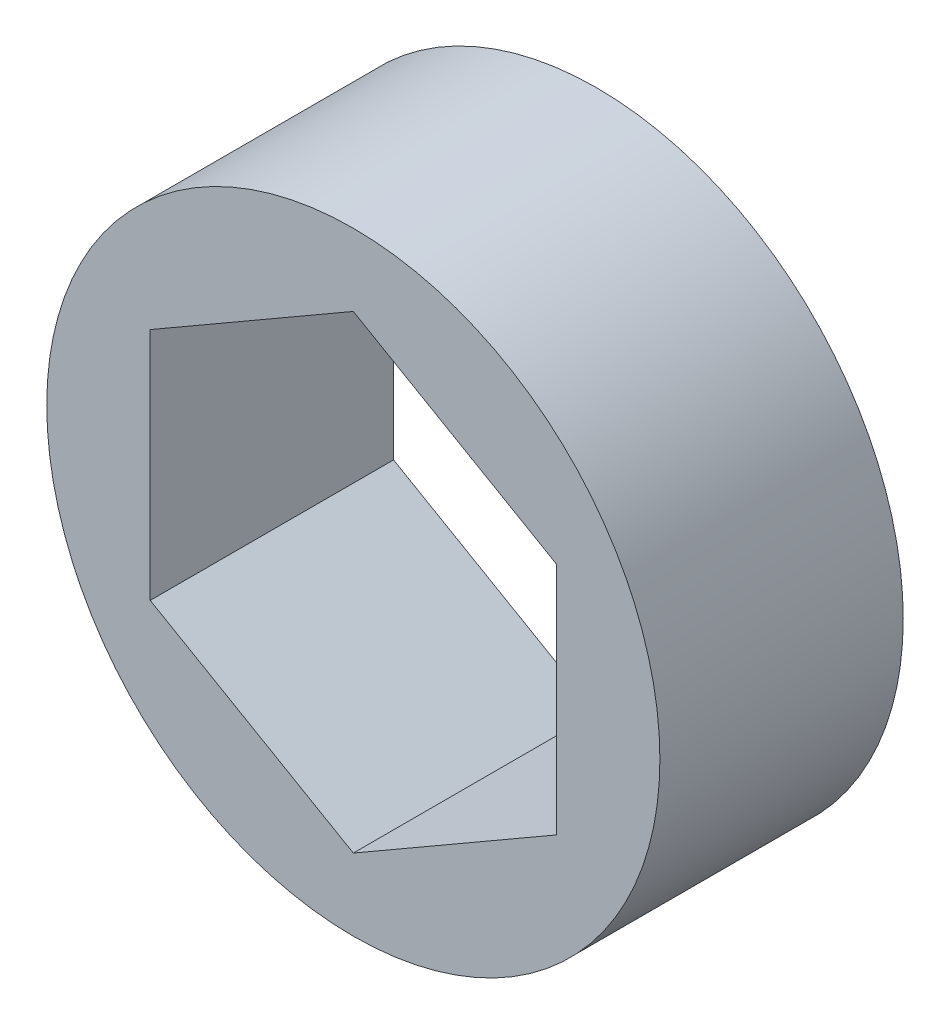
ISO-10303-21;
HEADER;
FILE_DESCRIPTION(('STEP AP214'),'2;1');
FILE_NAME('part.step','',(''),(''),'','','');
FILE_SCHEMA(('AUTOMOTIVE_DESIGN { 1 0 10303 214 1 1 1 1 }'));
ENDSEC;
DATA;
#1=APPLICATION_CONTEXT('core data for automotive mechanical design processes');
#2=APPLICATION_PROTOCOL_DEFINITION('international standard','automotive_design',2000,#1);
#3=PRODUCT_CONTEXT('',#1,'mechanical');
#4=PRODUCT('Part','Part','',(#3));
#5=PRODUCT_RELATED_PRODUCT_CATEGORY('part','',(#4));
#6=PRODUCT_DEFINITION_FORMATION('','',#4);
#7=PRODUCT_DEFINITION_CONTEXT('part definition',#1,'design');
#8=PRODUCT_DEFINITION('design','',#6,#7);
#9=PRODUCT_DEFINITION_SHAPE('','',#8);
#10=(LENGTH_UNIT() NAMED_UNIT(*) SI_UNIT(.MILLI.,.METRE.));
#11=(NAMED_UNIT(*) PLANE_ANGLE_UNIT() SI_UNIT($,.RADIAN.));
#12=(NAMED_UNIT(*) SI_UNIT($,.STERADIAN.) SOLID_ANGLE_UNIT());
#13=UNCERTAINTY_MEASURE_WITH_UNIT(LENGTH_MEASURE(1.E-05),#10,'distance_accuracy_value','');
#14=(GEOMETRIC_REPRESENTATION_CONTEXT(3) GLOBAL_UNCERTAINTY_ASSIGNED_CONTEXT((#13)) GLOBAL_UNIT_ASSIGNED_CONTEXT((#10,
#11,#12)) REPRESENTATION_CONTEXT('',''));
#15=CARTESIAN_POINT('',(0.,0.,0.));
#16=DIRECTION('',(0.,0.,1.));
#17=DIRECTION('',(1.,0.,0.));
#18=AXIS2_PLACEMENT_3D('',#15,#16,#17);
#19=CARTESIAN_POINT('',(0.,0.,8.0645));
#20=DIRECTION('',(0.,0.,1.));
#21=DIRECTION('',(1.,0.,0.));
#22=AXIS2_PLACEMENT_3D('',#19,#20,#21);
#23=PLANE('',#22);
#24=CARTESIAN_POINT('',(0.,0.,8.0645));
#25=DIRECTION('',(0.,0.,1.));
#26=DIRECTION('',(1.,0.,0.));
#27=AXIS2_PLACEMENT_3D('',#24,#25,#26);
#28=CIRCLE('',#27,10.16);
#29=CARTESIAN_POINT('',(10.16,0.,8.0645));
#30=VERTEX_POINT('',#29);
#31=EDGE_CURVE('E11',#30,#30,#28,.T.);
#32=ORIENTED_EDGE('',*,*,#31,.T.);
#33=EDGE_LOOP('',(#32));
#34=FACE_BOUND('',#33,.T.);
#35=DIRECTION('',(-0.866025403784439,0.5,0.));
#36=VECTOR('',#35,1.);
#37=CARTESIAN_POINT('',(6.731,3.88614466191537,8.0645));
#38=LINE('',#37,#36);
#39=CARTESIAN_POINT('',(6.731,3.88614466191537,8.0645));
#40=VERTEX_POINT('',#39);
#41=CARTESIAN_POINT('',(0.,7.77228932383074,8.0645));
#42=VERTEX_POINT('',#41);
#43=EDGE_CURVE('E98',#40,#42,#38,.T.);
#44=ORIENTED_EDGE('',*,*,#43,.F.);
#45=DIRECTION('',(0.,1.,0.));
#46=VECTOR('',#45,1.);
#47=CARTESIAN_POINT('',(6.731,-3.88614466191537,8.0645));
#48=LINE('',#47,#46);
#49=CARTESIAN_POINT('',(6.731,-3.88614466191537,8.0645));
#50=VERTEX_POINT('',#49);
#51=EDGE_CURVE('E90',#50,#40,#48,.T.);
#52=ORIENTED_EDGE('',*,*,#51,.F.);
#53=DIRECTION('',(0.866025403784439,0.5,0.));
#54=VECTOR('',#53,1.);
#55=CARTESIAN_POINT('',(0.,-7.77228932383074,8.0645));
#56=LINE('',#55,#54);
#57=CARTESIAN_POINT('',(0.,-7.77228932383074,8.0645));
#58=VERTEX_POINT('',#57);
#59=EDGE_CURVE('E118',#58,#50,#56,.T.);
#60=ORIENTED_EDGE('',*,*,#59,.F.);
#61=DIRECTION('',(0.866025403784439,-0.5,0.));
#62=VECTOR('',#61,1.);
#63=CARTESIAN_POINT('',(-6.731,-3.88614466191537,8.0645));
#64=LINE('',#63,#62);
#65=CARTESIAN_POINT('',(-6.731,-3.88614466191537,8.0645));
#66=VERTEX_POINT('',#65);
#67=EDGE_CURVE('E116',#66,#58,#64,.T.);
#68=ORIENTED_EDGE('',*,*,#67,.F.);
#69=DIRECTION('',(0.,-1.,0.));
#70=VECTOR('',#69,1.);
#71=CARTESIAN_POINT('',(-6.731,3.88614466191537,8.0645));
#72=LINE('',#71,#70);
#73=CARTESIAN_POINT('',(-6.731,3.88614466191537,8.0645));
#74=VERTEX_POINT('',#73);
#75=EDGE_CURVE('E112',#74,#66,#72,.T.);
#76=ORIENTED_EDGE('',*,*,#75,.F.);
#77=DIRECTION('',(-0.866025403784439,-0.5,0.));
#78=VECTOR('',#77,1.);
#79=CARTESIAN_POINT('',(0.,7.77228932383074,8.0645));
#80=LINE('',#79,#78);
#81=EDGE_CURVE('E110',#42,#74,#80,.T.);
#82=ORIENTED_EDGE('',*,*,#81,.F.);
#83=EDGE_LOOP('',(#44,#52,#60,#68,#76,#82));
#84=FACE_BOUND('',#83,.T.);
#85=ADVANCED_FACE('F37',(#34,#84),#23,.T.);
#86=CARTESIAN_POINT('',(0.,0.,0.));
#87=DIRECTION('',(0.,0.,1.));
#88=DIRECTION('',(1.,0.,0.));
#89=AXIS2_PLACEMENT_3D('',#86,#87,#88);
#90=PLANE('',#89);
#91=CARTESIAN_POINT('',(0.,0.,0.));
#92=DIRECTION('',(0.,0.,1.));
#93=DIRECTION('',(1.,0.,0.));
#94=AXIS2_PLACEMENT_3D('',#91,#92,#93);
#95=CIRCLE('',#94,10.16);
#96=CARTESIAN_POINT('',(10.16,0.,0.));
#97=VERTEX_POINT('',#96);
#98=EDGE_CURVE('E41',#97,#97,#95,.T.);
#99=ORIENTED_EDGE('',*,*,#98,.F.);
#100=EDGE_LOOP('',(#99));
#101=FACE_BOUND('',#100,.T.);
#102=DIRECTION('',(0.,1.,0.));
#103=VECTOR('',#102,1.);
#104=CARTESIAN_POINT('',(6.731,-3.88614466191537,0.));
#105=LINE('',#104,#103);
#106=CARTESIAN_POINT('',(6.731,-3.88614466191537,0.));
#107=VERTEX_POINT('',#106);
#108=CARTESIAN_POINT('',(6.731,3.88614466191537,0.));
#109=VERTEX_POINT('',#108);
#110=EDGE_CURVE('E60',#107,#109,#105,.T.);
#111=ORIENTED_EDGE('',*,*,#110,.T.);
#112=DIRECTION('',(-0.866025403784439,0.5,0.));
#113=VECTOR('',#112,1.);
#114=CARTESIAN_POINT('',(6.731,3.88614466191537,0.));
#115=LINE('',#114,#113);
#116=CARTESIAN_POINT('',(0.,7.77228932383074,0.));
#117=VERTEX_POINT('',#116);
#118=EDGE_CURVE('E105',#109,#117,#115,.T.);
#119=ORIENTED_EDGE('',*,*,#118,.T.);
#120=DIRECTION('',(-0.866025403784439,-0.5,0.));
#121=VECTOR('',#120,1.);
#122=CARTESIAN_POINT('',(0.,7.77228932383074,0.));
#123=LINE('',#122,#121);
#124=CARTESIAN_POINT('',(-6.731,3.88614466191537,0.));
#125=VERTEX_POINT('',#124);
#126=EDGE_CURVE('E122',#117,#125,#123,.T.);
#127=ORIENTED_EDGE('',*,*,#126,.T.);
#128=DIRECTION('',(0.,-1.,0.));
#129=VECTOR('',#128,1.);
#130=CARTESIAN_POINT('',(-6.731,3.88614466191537,0.));
#131=LINE('',#130,#129);
#132=CARTESIAN_POINT('',(-6.731,-3.88614466191537,0.));
#133=VERTEX_POINT('',#132);
#134=EDGE_CURVE('E125',#125,#133,#131,.T.);
#135=ORIENTED_EDGE('',*,*,#134,.T.);
#136=DIRECTION('',(0.866025403784439,-0.5,0.));
#137=VECTOR('',#136,1.);
#138=CARTESIAN_POINT('',(-6.731,-3.88614466191537,0.));
#139=LINE('',#138,#137);
#140=CARTESIAN_POINT('',(0.,-7.77228932383074,0.));
#141=VERTEX_POINT('',#140);
#142=EDGE_CURVE('E128',#133,#141,#139,.T.);
#143=ORIENTED_EDGE('',*,*,#142,.T.);
#144=DIRECTION('',(0.866025403784439,0.5,0.));
#145=VECTOR('',#144,1.);
#146=CARTESIAN_POINT('',(0.,-7.77228932383074,0.));
#147=LINE('',#146,#145);
#148=EDGE_CURVE('E99',#141,#107,#147,.T.);
#149=ORIENTED_EDGE('',*,*,#148,.T.);
#150=EDGE_LOOP('',(#111,#119,#127,#135,#143,#149));
#151=FACE_BOUND('',#150,.T.);
#152=ADVANCED_FACE('F145',(#101,#151),#90,.F.);
#153=CARTESIAN_POINT('',(0.,0.,8.0645));
#154=DIRECTION('',(0.,0.,-1.));
#155=DIRECTION('',(-1.,0.,0.));
#156=AXIS2_PLACEMENT_3D('',#153,#154,#155);
#157=CYLINDRICAL_SURFACE('',#156,10.16);
#158=ORIENTED_EDGE('',*,*,#31,.F.);
#159=EDGE_LOOP('',(#158));
#160=FACE_BOUND('',#159,.T.);
#161=ORIENTED_EDGE('',*,*,#98,.T.);
#162=EDGE_LOOP('',(#161));
#163=FACE_BOUND('',#162,.T.);
#164=ADVANCED_FACE('F39',(#160,#163),#157,.T.);
#165=CARTESIAN_POINT('',(6.731,-3.88614466191537,8.0645));
#166=DIRECTION('',(-1.,0.,0.));
#167=DIRECTION('',(0.,-1.,0.));
#168=AXIS2_PLACEMENT_3D('',#165,#166,#167);
#169=PLANE('',#168);
#170=ORIENTED_EDGE('',*,*,#110,.F.);
#171=DIRECTION('',(0.,0.,-1.));
#172=VECTOR('',#171,1.);
#173=CARTESIAN_POINT('',(6.731,-3.88614466191537,8.0645));
#174=LINE('',#173,#172);
#175=EDGE_CURVE('E94',#50,#107,#174,.T.);
#176=ORIENTED_EDGE('',*,*,#175,.F.);
#177=ORIENTED_EDGE('',*,*,#51,.T.);
#178=DIRECTION('',(0.,0.,-1.));
#179=VECTOR('',#178,1.);
#180=CARTESIAN_POINT('',(6.731,3.88614466191537,8.0645));
#181=LINE('',#180,#179);
#182=EDGE_CURVE('E93',#40,#109,#181,.T.);
#183=ORIENTED_EDGE('',*,*,#182,.T.);
#184=EDGE_LOOP('',(#170,#176,#177,#183));
#185=FACE_BOUND('',#184,.T.);
#186=ADVANCED_FACE('F92',(#185),#169,.T.);
#187=CARTESIAN_POINT('',(6.731,3.88614466191537,8.0645));
#188=DIRECTION('',(-0.5,-0.866025403784439,0.));
#189=DIRECTION('',(0.866025403784439,-0.5,0.));
#190=AXIS2_PLACEMENT_3D('',#187,#188,#189);
#191=PLANE('',#190);
#192=ORIENTED_EDGE('',*,*,#118,.F.);
#193=ORIENTED_EDGE('',*,*,#182,.F.);
#194=ORIENTED_EDGE('',*,*,#43,.T.);
#195=DIRECTION('',(0.,0.,-1.));
#196=VECTOR('',#195,1.);
#197=CARTESIAN_POINT('',(0.,7.77228932383074,8.0645));
#198=LINE('',#197,#196);
#199=EDGE_CURVE('E106',#42,#117,#198,.T.);
#200=ORIENTED_EDGE('',*,*,#199,.T.);
#201=EDGE_LOOP('',(#192,#193,#194,#200));
#202=FACE_BOUND('',#201,.T.);
#203=ADVANCED_FACE('F102',(#202),#191,.T.);
#204=CARTESIAN_POINT('',(0.,7.77228932383074,8.0645));
#205=DIRECTION('',(0.5,-0.866025403784439,0.));
#206=DIRECTION('',(0.866025403784439,0.5,0.));
#207=AXIS2_PLACEMENT_3D('',#204,#205,#206);
#208=PLANE('',#207);
#209=ORIENTED_EDGE('',*,*,#126,.F.);
#210=ORIENTED_EDGE('',*,*,#199,.F.);
#211=ORIENTED_EDGE('',*,*,#81,.T.);
#212=DIRECTION('',(0.,0.,-1.));
#213=VECTOR('',#212,1.);
#214=CARTESIAN_POINT('',(-6.731,3.88614466191537,8.0645));
#215=LINE('',#214,#213);
#216=EDGE_CURVE('E137',#74,#125,#215,.T.);
#217=ORIENTED_EDGE('',*,*,#216,.T.);
#218=EDGE_LOOP('',(#209,#210,#211,#217));
#219=FACE_BOUND('',#218,.T.);
#220=ADVANCED_FACE('F141',(#219),#208,.T.);
#221=CARTESIAN_POINT('',(-6.731,3.88614466191537,8.0645));
#222=DIRECTION('',(1.,0.,0.));
#223=DIRECTION('',(0.,1.,0.));
#224=AXIS2_PLACEMENT_3D('',#221,#222,#223);
#225=PLANE('',#224);
#226=ORIENTED_EDGE('',*,*,#134,.F.);
#227=ORIENTED_EDGE('',*,*,#216,.F.);
#228=ORIENTED_EDGE('',*,*,#75,.T.);
#229=DIRECTION('',(0.,0.,-1.));
#230=VECTOR('',#229,1.);
#231=CARTESIAN_POINT('',(-6.731,-3.88614466191537,8.0645));
#232=LINE('',#231,#230);
#233=EDGE_CURVE('E135',#66,#133,#232,.T.);
#234=ORIENTED_EDGE('',*,*,#233,.T.);
#235=EDGE_LOOP('',(#226,#227,#228,#234));
#236=FACE_BOUND('',#235,.T.);
#237=ADVANCED_FACE('F153',(#236),#225,.T.);
#238=CARTESIAN_POINT('',(-6.731,-3.88614466191537,8.0645));
#239=DIRECTION('',(0.5,0.866025403784439,0.));
#240=DIRECTION('',(-0.866025403784439,0.5,0.));
#241=AXIS2_PLACEMENT_3D('',#238,#239,#240);
#242=PLANE('',#241);
#243=ORIENTED_EDGE('',*,*,#142,.F.);
#244=ORIENTED_EDGE('',*,*,#233,.F.);
#245=ORIENTED_EDGE('',*,*,#67,.T.);
#246=DIRECTION('',(0.,0.,-1.));
#247=VECTOR('',#246,1.);
#248=CARTESIAN_POINT('',(0.,-7.77228932383074,8.0645));
#249=LINE('',#248,#247);
#250=EDGE_CURVE('E52',#58,#141,#249,.T.);
#251=ORIENTED_EDGE('',*,*,#250,.T.);
#252=EDGE_LOOP('',(#243,#244,#245,#251));
#253=FACE_BOUND('',#252,.T.);
#254=ADVANCED_FACE('F151',(#253),#242,.T.);
#255=CARTESIAN_POINT('',(0.,-7.77228932383074,8.0645));
#256=DIRECTION('',(-0.5,0.866025403784439,0.));
#257=DIRECTION('',(-0.866025403784439,-0.5,0.));
#258=AXIS2_PLACEMENT_3D('',#255,#256,#257);
#259=PLANE('',#258);
#260=ORIENTED_EDGE('',*,*,#148,.F.);
#261=ORIENTED_EDGE('',*,*,#250,.F.);
#262=ORIENTED_EDGE('',*,*,#59,.T.);
#263=ORIENTED_EDGE('',*,*,#175,.T.);
#264=EDGE_LOOP('',(#260,#261,#262,#263));
#265=FACE_BOUND('',#264,.T.);
#266=ADVANCED_FACE('F147',(#265),#259,.T.);
#267=CLOSED_SHELL('',(#85,#152,#164,#186,#203,#220,#237,#254,#266));
#268=MANIFOLD_SOLID_BREP('B2',#267);
#269=ADVANCED_BREP_SHAPE_REPRESENTATION('',(#18,#268),#14);
#270=SHAPE_DEFINITION_REPRESENTATION(#9,#269);
ENDSEC;
END-ISO-10303-21;
